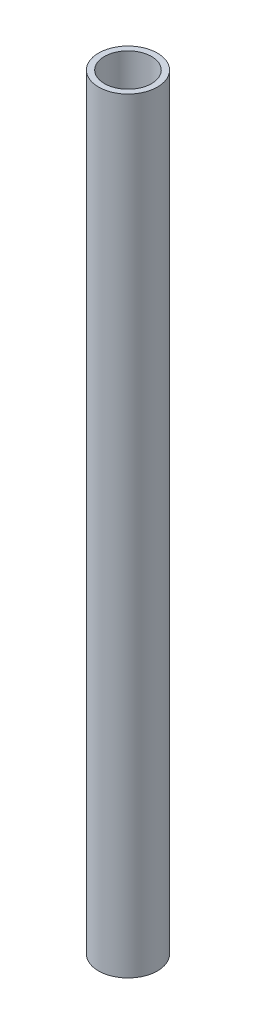
ISO-10303-21;
HEADER;
FILE_DESCRIPTION(('STEP AP214'),'2;1');
FILE_NAME('part.step','',(''),(''),'','','');
FILE_SCHEMA(('AUTOMOTIVE_DESIGN { 1 0 10303 214 1 1 1 1 }'));
ENDSEC;
DATA;
#1=APPLICATION_CONTEXT('core data for automotive mechanical design processes');
#2=APPLICATION_PROTOCOL_DEFINITION('international standard','automotive_design',2000,#1);
#3=PRODUCT_CONTEXT('',#1,'mechanical');
#4=PRODUCT('Part','Part','',(#3));
#5=PRODUCT_RELATED_PRODUCT_CATEGORY('part','',(#4));
#6=PRODUCT_DEFINITION_FORMATION('','',#4);
#7=PRODUCT_DEFINITION_CONTEXT('part definition',#1,'design');
#8=PRODUCT_DEFINITION('design','',#6,#7);
#9=PRODUCT_DEFINITION_SHAPE('','',#8);
#10=(LENGTH_UNIT() NAMED_UNIT(*) SI_UNIT(.MILLI.,.METRE.));
#11=(NAMED_UNIT(*) PLANE_ANGLE_UNIT() SI_UNIT($,.RADIAN.));
#12=(NAMED_UNIT(*) SI_UNIT($,.STERADIAN.) SOLID_ANGLE_UNIT());
#13=UNCERTAINTY_MEASURE_WITH_UNIT(LENGTH_MEASURE(1.E-05),#10,'distance_accuracy_value','');
#14=(GEOMETRIC_REPRESENTATION_CONTEXT(3) GLOBAL_UNCERTAINTY_ASSIGNED_CONTEXT((#13)) GLOBAL_UNIT_ASSIGNED_CONTEXT((#10,
#11,#12)) REPRESENTATION_CONTEXT('',''));
#15=CARTESIAN_POINT('',(0.,0.,0.));
#16=DIRECTION('',(0.,0.,1.));
#17=DIRECTION('',(1.,0.,0.));
#18=AXIS2_PLACEMENT_3D('',#15,#16,#17);
#19=CARTESIAN_POINT('',(0.,260.,0.));
#20=DIRECTION('',(0.,1.,0.));
#21=DIRECTION('',(0.,0.,1.));
#22=AXIS2_PLACEMENT_3D('',#19,#20,#21);
#23=PLANE('',#22);
#24=CARTESIAN_POINT('',(0.,260.,0.));
#25=DIRECTION('',(0.,1.,0.));
#26=DIRECTION('',(0.,0.,1.));
#27=AXIS2_PLACEMENT_3D('',#24,#25,#26);
#28=CIRCLE('',#27,10.);
#29=CARTESIAN_POINT('',(0.,260.,10.));
#30=VERTEX_POINT('',#29);
#31=EDGE_CURVE('E10',#30,#30,#28,.T.);
#32=ORIENTED_EDGE('',*,*,#31,.T.);
#33=EDGE_LOOP('',(#32));
#34=FACE_BOUND('',#33,.T.);
#35=CARTESIAN_POINT('',(0.,260.,0.));
#36=DIRECTION('',(0.,1.,0.));
#37=DIRECTION('',(0.,0.,1.));
#38=AXIS2_PLACEMENT_3D('',#35,#36,#37);
#39=CIRCLE('',#38,8.);
#40=CARTESIAN_POINT('',(0.,260.,8.));
#41=VERTEX_POINT('',#40);
#42=EDGE_CURVE('E44',#41,#41,#39,.T.);
#43=ORIENTED_EDGE('',*,*,#42,.F.);
#44=EDGE_LOOP('',(#43));
#45=FACE_BOUND('',#44,.T.);
#46=ADVANCED_FACE('F33',(#34,#45),#23,.T.);
#47=CARTESIAN_POINT('',(0.,0.,0.));
#48=DIRECTION('',(0.,1.,0.));
#49=DIRECTION('',(0.,0.,1.));
#50=AXIS2_PLACEMENT_3D('',#47,#48,#49);
#51=PLANE('',#50);
#52=CARTESIAN_POINT('',(0.,0.,0.));
#53=DIRECTION('',(0.,1.,0.));
#54=DIRECTION('',(0.,0.,1.));
#55=AXIS2_PLACEMENT_3D('',#52,#53,#54);
#56=CIRCLE('',#55,10.);
#57=CARTESIAN_POINT('',(0.,0.,10.));
#58=VERTEX_POINT('',#57);
#59=EDGE_CURVE('E37',#58,#58,#56,.T.);
#60=ORIENTED_EDGE('',*,*,#59,.F.);
#61=EDGE_LOOP('',(#60));
#62=FACE_BOUND('',#61,.T.);
#63=CARTESIAN_POINT('',(0.,0.,0.));
#64=DIRECTION('',(0.,1.,0.));
#65=DIRECTION('',(0.,0.,1.));
#66=AXIS2_PLACEMENT_3D('',#63,#64,#65);
#67=CIRCLE('',#66,8.);
#68=CARTESIAN_POINT('',(0.,0.,8.));
#69=VERTEX_POINT('',#68);
#70=EDGE_CURVE('E46',#69,#69,#67,.T.);
#71=ORIENTED_EDGE('',*,*,#70,.T.);
#72=EDGE_LOOP('',(#71));
#73=FACE_BOUND('',#72,.T.);
#74=ADVANCED_FACE('F56',(#62,#73),#51,.F.);
#75=CARTESIAN_POINT('',(0.,260.,0.));
#76=DIRECTION('',(0.,-1.,0.));
#77=DIRECTION('',(0.,0.,-1.));
#78=AXIS2_PLACEMENT_3D('',#75,#76,#77);
#79=CYLINDRICAL_SURFACE('',#78,10.);
#80=ORIENTED_EDGE('',*,*,#31,.F.);
#81=EDGE_LOOP('',(#80));
#82=FACE_BOUND('',#81,.T.);
#83=ORIENTED_EDGE('',*,*,#59,.T.);
#84=EDGE_LOOP('',(#83));
#85=FACE_BOUND('',#84,.T.);
#86=ADVANCED_FACE('F35',(#82,#85),#79,.T.);
#87=CARTESIAN_POINT('',(0.,260.,0.));
#88=DIRECTION('',(0.,-1.,0.));
#89=DIRECTION('',(0.,0.,-1.));
#90=AXIS2_PLACEMENT_3D('',#87,#88,#89);
#91=CYLINDRICAL_SURFACE('',#90,8.);
#92=ORIENTED_EDGE('',*,*,#42,.T.);
#93=EDGE_LOOP('',(#92));
#94=FACE_BOUND('',#93,.T.);
#95=ORIENTED_EDGE('',*,*,#70,.F.);
#96=EDGE_LOOP('',(#95));
#97=FACE_BOUND('',#96,.T.);
#98=ADVANCED_FACE('F52',(#94,#97),#91,.F.);
#99=CLOSED_SHELL('',(#46,#74,#86,#98));
#100=MANIFOLD_SOLID_BREP('B2',#99);
#101=ADVANCED_BREP_SHAPE_REPRESENTATION('',(#18,#100),#14);
#102=SHAPE_DEFINITION_REPRESENTATION(#9,#101);
ENDSEC;
END-ISO-10303-21;
